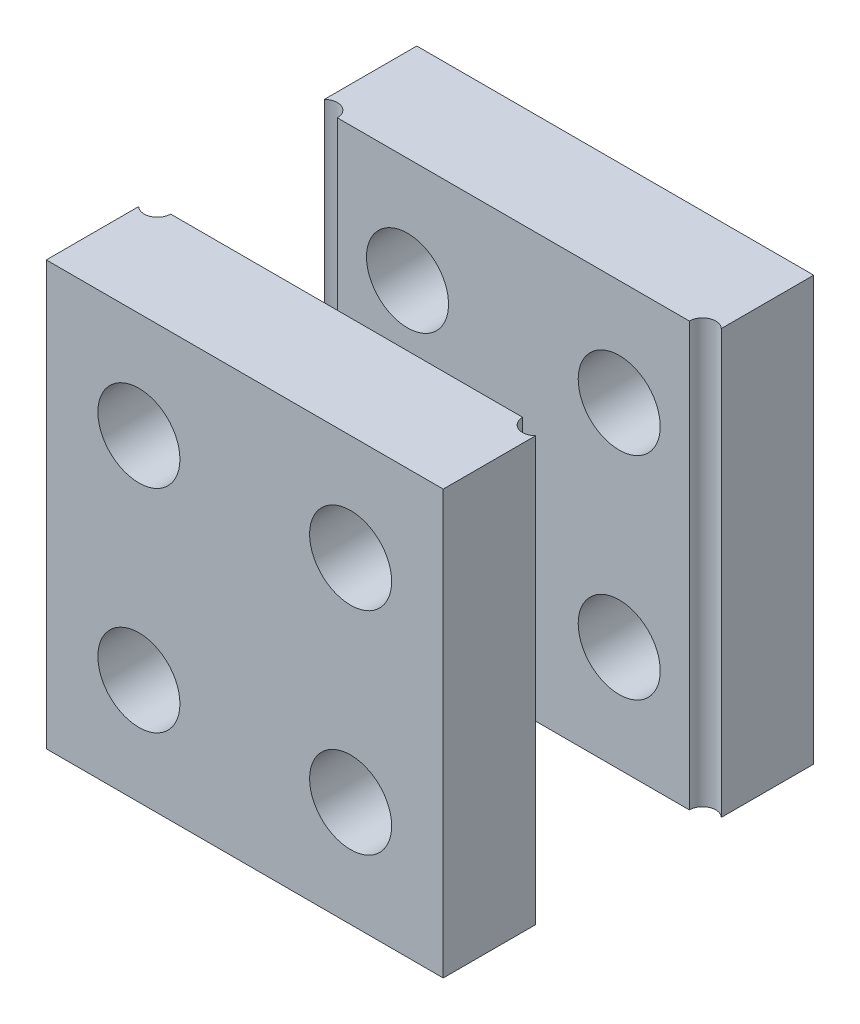
ISO-10303-21;
HEADER;
FILE_DESCRIPTION(('STEP AP214'),'2;1');
FILE_NAME('part.step','',(''),(''),'','','');
FILE_SCHEMA(('AUTOMOTIVE_DESIGN { 1 0 10303 214 1 1 1 1 }'));
ENDSEC;
DATA;
#1=APPLICATION_CONTEXT('core data for automotive mechanical design processes');
#2=APPLICATION_PROTOCOL_DEFINITION('international standard','automotive_design',2000,#1);
#3=PRODUCT_CONTEXT('',#1,'mechanical');
#4=PRODUCT('Part','Part','',(#3));
#5=PRODUCT_RELATED_PRODUCT_CATEGORY('part','',(#4));
#6=PRODUCT_DEFINITION_FORMATION('','',#4);
#7=PRODUCT_DEFINITION_CONTEXT('part definition',#1,'design');
#8=PRODUCT_DEFINITION('design','',#6,#7);
#9=PRODUCT_DEFINITION_SHAPE('','',#8);
#10=(LENGTH_UNIT() NAMED_UNIT(*) SI_UNIT(.MILLI.,.METRE.));
#11=(NAMED_UNIT(*) PLANE_ANGLE_UNIT() SI_UNIT($,.RADIAN.));
#12=(NAMED_UNIT(*) SI_UNIT($,.STERADIAN.) SOLID_ANGLE_UNIT());
#13=UNCERTAINTY_MEASURE_WITH_UNIT(LENGTH_MEASURE(1.E-05),#10,'distance_accuracy_value','');
#14=(GEOMETRIC_REPRESENTATION_CONTEXT(3) GLOBAL_UNCERTAINTY_ASSIGNED_CONTEXT((#13)) GLOBAL_UNIT_ASSIGNED_CONTEXT((#10,
#11,#12)) REPRESENTATION_CONTEXT('',''));
#15=CARTESIAN_POINT('',(0.,0.,0.));
#16=DIRECTION('',(0.,0.,1.));
#17=DIRECTION('',(1.,0.,0.));
#18=AXIS2_PLACEMENT_3D('',#15,#16,#17);
#19=CARTESIAN_POINT('',(7.5,-8.,14.));
#20=DIRECTION('',(0.,1.,0.));
#21=DIRECTION('',(-1.,0.,0.));
#22=AXIS2_PLACEMENT_3D('',#19,#20,#21);
#23=PLANE('',#22);
#24=DIRECTION('',(-1.,0.,0.));
#25=VECTOR('',#24,1.);
#26=CARTESIAN_POINT('',(0.,-8.,3.85));
#27=LINE('',#26,#25);
#28=CARTESIAN_POINT('',(6.65,-8.,3.85));
#29=VERTEX_POINT('',#28);
#30=CARTESIAN_POINT('',(-6.65,-8.,3.85));
#31=VERTEX_POINT('',#30);
#32=EDGE_CURVE('E161',#29,#31,#27,.T.);
#33=ORIENTED_EDGE('',*,*,#32,.T.);
#34=CARTESIAN_POINT('',(-7.15,-8.,3.85));
#35=DIRECTION('',(0.,1.,0.));
#36=DIRECTION('',(-1.,0.,0.));
#37=AXIS2_PLACEMENT_3D('',#34,#35,#36);
#38=CIRCLE('',#37,0.500000000000001);
#39=CARTESIAN_POINT('',(-7.5,-8.,3.49292857857286));
#40=VERTEX_POINT('',#39);
#41=EDGE_CURVE('E113',#31,#40,#38,.T.);
#42=ORIENTED_EDGE('',*,*,#41,.T.);
#43=DIRECTION('',(0.,0.,-1.));
#44=VECTOR('',#43,1.);
#45=CARTESIAN_POINT('',(-7.5,-8.00000000000001,14.));
#46=LINE('',#45,#44);
#47=CARTESIAN_POINT('',(-7.5,-8.00000000000001,0.));
#48=VERTEX_POINT('',#47);
#49=EDGE_CURVE('E107',#40,#48,#46,.T.);
#50=ORIENTED_EDGE('',*,*,#49,.T.);
#51=DIRECTION('',(1.,0.,0.));
#52=VECTOR('',#51,1.);
#53=CARTESIAN_POINT('',(7.5,-8.,0.));
#54=LINE('',#53,#52);
#55=CARTESIAN_POINT('',(7.5,-8.,0.));
#56=VERTEX_POINT('',#55);
#57=EDGE_CURVE('E111',#48,#56,#54,.T.);
#58=ORIENTED_EDGE('',*,*,#57,.T.);
#59=DIRECTION('',(0.,0.,-1.));
#60=VECTOR('',#59,1.);
#61=CARTESIAN_POINT('',(7.5,-8.,14.));
#62=LINE('',#61,#60);
#63=CARTESIAN_POINT('',(7.5,-8.,3.49292857857286));
#64=VERTEX_POINT('',#63);
#65=EDGE_CURVE('E123',#64,#56,#62,.T.);
#66=ORIENTED_EDGE('',*,*,#65,.F.);
#67=CARTESIAN_POINT('',(7.15,-8.,3.85));
#68=DIRECTION('',(0.,1.,0.));
#69=DIRECTION('',(-1.,0.,0.));
#70=AXIS2_PLACEMENT_3D('',#67,#68,#69);
#71=CIRCLE('',#70,0.500000000000001);
#72=EDGE_CURVE('E157',#29,#64,#71,.F.);
#73=ORIENTED_EDGE('',*,*,#72,.F.);
#74=EDGE_LOOP('',(#33,#42,#50,#58,#66,#73));
#75=FACE_BOUND('',#74,.T.);
#76=ADVANCED_FACE('F45',(#75),#23,.F.);
#77=CARTESIAN_POINT('',(7.5,-8.,14.));
#78=DIRECTION('',(-1.,0.,0.));
#79=DIRECTION('',(0.,-1.,0.));
#80=AXIS2_PLACEMENT_3D('',#77,#78,#79);
#81=PLANE('',#80);
#82=DIRECTION('',(0.,1.,0.));
#83=VECTOR('',#82,1.);
#84=CARTESIAN_POINT('',(7.5,-8.,3.49292857857286));
#85=LINE('',#84,#83);
#86=CARTESIAN_POINT('',(7.5,8.,3.49292857857286));
#87=VERTEX_POINT('',#86);
#88=EDGE_CURVE('E149',#64,#87,#85,.T.);
#89=ORIENTED_EDGE('',*,*,#88,.F.);
#90=ORIENTED_EDGE('',*,*,#65,.T.);
#91=DIRECTION('',(0.,1.,0.));
#92=VECTOR('',#91,1.);
#93=CARTESIAN_POINT('',(7.5,-8.,0.));
#94=LINE('',#93,#92);
#95=CARTESIAN_POINT('',(7.5,8.,0.));
#96=VERTEX_POINT('',#95);
#97=EDGE_CURVE('E122',#56,#96,#94,.T.);
#98=ORIENTED_EDGE('',*,*,#97,.T.);
#99=DIRECTION('',(0.,0.,-1.));
#100=VECTOR('',#99,1.);
#101=CARTESIAN_POINT('',(7.5,8.,14.));
#102=LINE('',#101,#100);
#103=EDGE_CURVE('E165',#87,#96,#102,.T.);
#104=ORIENTED_EDGE('',*,*,#103,.F.);
#105=EDGE_LOOP('',(#89,#90,#98,#104));
#106=FACE_BOUND('',#105,.T.);
#107=ADVANCED_FACE('F197',(#106),#81,.F.);
#108=CARTESIAN_POINT('',(7.5,8.,14.));
#109=DIRECTION('',(0.,-1.,0.));
#110=DIRECTION('',(1.,0.,0.));
#111=AXIS2_PLACEMENT_3D('',#108,#109,#110);
#112=PLANE('',#111);
#113=DIRECTION('',(0.,0.,-1.));
#114=VECTOR('',#113,1.);
#115=CARTESIAN_POINT('',(-7.5,8.,14.));
#116=LINE('',#115,#114);
#117=CARTESIAN_POINT('',(-7.5,8.,3.49292857857286));
#118=VERTEX_POINT('',#117);
#119=CARTESIAN_POINT('',(-7.5,8.,0.));
#120=VERTEX_POINT('',#119);
#121=EDGE_CURVE('E95',#118,#120,#116,.T.);
#122=ORIENTED_EDGE('',*,*,#121,.F.);
#123=CARTESIAN_POINT('',(-7.15,8.,3.85));
#124=DIRECTION('',(0.,1.,0.));
#125=DIRECTION('',(-1.,0.,0.));
#126=AXIS2_PLACEMENT_3D('',#123,#124,#125);
#127=CIRCLE('',#126,0.500000000000001);
#128=CARTESIAN_POINT('',(-6.65,8.,3.85));
#129=VERTEX_POINT('',#128);
#130=EDGE_CURVE('E49',#118,#129,#127,.F.);
#131=ORIENTED_EDGE('',*,*,#130,.T.);
#132=DIRECTION('',(-1.,0.,0.));
#133=VECTOR('',#132,1.);
#134=CARTESIAN_POINT('',(0.,8.,3.85));
#135=LINE('',#134,#133);
#136=CARTESIAN_POINT('',(6.65,8.,3.85));
#137=VERTEX_POINT('',#136);
#138=EDGE_CURVE('E12',#137,#129,#135,.T.);
#139=ORIENTED_EDGE('',*,*,#138,.F.);
#140=CARTESIAN_POINT('',(7.15,8.,3.85));
#141=DIRECTION('',(0.,1.,0.));
#142=DIRECTION('',(-1.,0.,0.));
#143=AXIS2_PLACEMENT_3D('',#140,#141,#142);
#144=CIRCLE('',#143,0.500000000000001);
#145=EDGE_CURVE('E127',#87,#137,#144,.T.);
#146=ORIENTED_EDGE('',*,*,#145,.F.);
#147=ORIENTED_EDGE('',*,*,#103,.T.);
#148=DIRECTION('',(-1.,0.,0.));
#149=VECTOR('',#148,1.);
#150=CARTESIAN_POINT('',(7.5,8.,0.));
#151=LINE('',#150,#149);
#152=EDGE_CURVE('E136',#96,#120,#151,.T.);
#153=ORIENTED_EDGE('',*,*,#152,.T.);
#154=EDGE_LOOP('',(#122,#131,#139,#146,#147,#153));
#155=FACE_BOUND('',#154,.T.);
#156=ADVANCED_FACE('F175',(#155),#112,.F.);
#157=CARTESIAN_POINT('',(0.,0.,0.));
#158=DIRECTION('',(0.,0.,1.));
#159=DIRECTION('',(1.,0.,0.));
#160=AXIS2_PLACEMENT_3D('',#157,#158,#159);
#161=PLANE('',#160);
#162=DIRECTION('',(0.,-1.,0.));
#163=VECTOR('',#162,1.);
#164=CARTESIAN_POINT('',(-7.5,-8.00000000000001,0.));
#165=LINE('',#164,#163);
#166=EDGE_CURVE('E120',#120,#48,#165,.T.);
#167=ORIENTED_EDGE('',*,*,#166,.F.);
#168=ORIENTED_EDGE('',*,*,#152,.F.);
#169=ORIENTED_EDGE('',*,*,#97,.F.);
#170=ORIENTED_EDGE('',*,*,#57,.F.);
#171=EDGE_LOOP('',(#167,#168,#169,#170));
#172=FACE_BOUND('',#171,.T.);
#173=CARTESIAN_POINT('',(-4.,4.,0.));
#174=DIRECTION('',(0.,0.,1.));
#175=DIRECTION('',(1.,0.,0.));
#176=AXIS2_PLACEMENT_3D('',#173,#174,#175);
#177=CIRCLE('',#176,1.55);
#178=CARTESIAN_POINT('',(-2.45,4.,0.));
#179=VERTEX_POINT('',#178);
#180=EDGE_CURVE('E132',#179,#179,#177,.T.);
#181=ORIENTED_EDGE('',*,*,#180,.T.);
#182=EDGE_LOOP('',(#181));
#183=FACE_BOUND('',#182,.T.);
#184=CARTESIAN_POINT('',(4.,4.,0.));
#185=DIRECTION('',(0.,0.,1.));
#186=DIRECTION('',(1.,0.,0.));
#187=AXIS2_PLACEMENT_3D('',#184,#185,#186);
#188=CIRCLE('',#187,1.55);
#189=CARTESIAN_POINT('',(5.55,4.,0.));
#190=VERTEX_POINT('',#189);
#191=EDGE_CURVE('E135',#190,#190,#188,.T.);
#192=ORIENTED_EDGE('',*,*,#191,.T.);
#193=EDGE_LOOP('',(#192));
#194=FACE_BOUND('',#193,.T.);
#195=CARTESIAN_POINT('',(-4.,-4.,0.));
#196=DIRECTION('',(0.,0.,1.));
#197=DIRECTION('',(1.,0.,0.));
#198=AXIS2_PLACEMENT_3D('',#195,#196,#197);
#199=CIRCLE('',#198,1.55);
#200=CARTESIAN_POINT('',(-2.45,-4.,0.));
#201=VERTEX_POINT('',#200);
#202=EDGE_CURVE('E139',#201,#201,#199,.T.);
#203=ORIENTED_EDGE('',*,*,#202,.T.);
#204=EDGE_LOOP('',(#203));
#205=FACE_BOUND('',#204,.T.);
#206=CARTESIAN_POINT('',(4.,-4.,0.));
#207=DIRECTION('',(0.,0.,1.));
#208=DIRECTION('',(1.,0.,0.));
#209=AXIS2_PLACEMENT_3D('',#206,#207,#208);
#210=CIRCLE('',#209,1.55);
#211=CARTESIAN_POINT('',(5.55,-4.,0.));
#212=VERTEX_POINT('',#211);
#213=EDGE_CURVE('E142',#212,#212,#210,.T.);
#214=ORIENTED_EDGE('',*,*,#213,.T.);
#215=EDGE_LOOP('',(#214));
#216=FACE_BOUND('',#215,.T.);
#217=ADVANCED_FACE('F117',(#172,#183,#194,#205,#216),#161,.F.);
#218=CARTESIAN_POINT('',(-7.5,-8.00000000000001,14.));
#219=DIRECTION('',(1.,0.,0.));
#220=DIRECTION('',(0.,1.,0.));
#221=AXIS2_PLACEMENT_3D('',#218,#219,#220);
#222=PLANE('',#221);
#223=ORIENTED_EDGE('',*,*,#49,.F.);
#224=DIRECTION('',(0.,1.,0.));
#225=VECTOR('',#224,1.);
#226=CARTESIAN_POINT('',(-7.5,-8.,3.49292857857286));
#227=LINE('',#226,#225);
#228=EDGE_CURVE('E87',#40,#118,#227,.T.);
#229=ORIENTED_EDGE('',*,*,#228,.T.);
#230=ORIENTED_EDGE('',*,*,#121,.T.);
#231=ORIENTED_EDGE('',*,*,#166,.T.);
#232=EDGE_LOOP('',(#223,#229,#230,#231));
#233=FACE_BOUND('',#232,.T.);
#234=ADVANCED_FACE('F125',(#233),#222,.F.);
#235=CARTESIAN_POINT('',(-4.,4.,14.));
#236=DIRECTION('',(0.,0.,-1.));
#237=DIRECTION('',(-1.,0.,0.));
#238=AXIS2_PLACEMENT_3D('',#235,#236,#237);
#239=CYLINDRICAL_SURFACE('',#238,1.55);
#240=CARTESIAN_POINT('',(-4.,4.,3.85));
#241=DIRECTION('',(0.,0.,-1.));
#242=DIRECTION('',(-1.,0.,0.));
#243=AXIS2_PLACEMENT_3D('',#240,#241,#242);
#244=CIRCLE('',#243,1.55);
#245=CARTESIAN_POINT('',(-5.55,4.,3.85));
#246=VERTEX_POINT('',#245);
#247=EDGE_CURVE('E145',#246,#246,#244,.T.);
#248=ORIENTED_EDGE('',*,*,#247,.F.);
#249=EDGE_LOOP('',(#248));
#250=FACE_BOUND('',#249,.T.);
#251=ORIENTED_EDGE('',*,*,#180,.F.);
#252=EDGE_LOOP('',(#251));
#253=FACE_BOUND('',#252,.T.);
#254=ADVANCED_FACE('F195',(#250,#253),#239,.F.);
#255=CARTESIAN_POINT('',(4.,4.,14.));
#256=DIRECTION('',(0.,0.,-1.));
#257=DIRECTION('',(-1.,0.,0.));
#258=AXIS2_PLACEMENT_3D('',#255,#256,#257);
#259=CYLINDRICAL_SURFACE('',#258,1.55);
#260=CARTESIAN_POINT('',(4.,4.,3.85));
#261=DIRECTION('',(0.,0.,-1.));
#262=DIRECTION('',(-1.,0.,0.));
#263=AXIS2_PLACEMENT_3D('',#260,#261,#262);
#264=CIRCLE('',#263,1.55);
#265=CARTESIAN_POINT('',(2.45,4.,3.85));
#266=VERTEX_POINT('',#265);
#267=EDGE_CURVE('E148',#266,#266,#264,.T.);
#268=ORIENTED_EDGE('',*,*,#267,.F.);
#269=EDGE_LOOP('',(#268));
#270=FACE_BOUND('',#269,.T.);
#271=ORIENTED_EDGE('',*,*,#191,.F.);
#272=EDGE_LOOP('',(#271));
#273=FACE_BOUND('',#272,.T.);
#274=ADVANCED_FACE('F208',(#270,#273),#259,.F.);
#275=CARTESIAN_POINT('',(-4.,-4.,14.));
#276=DIRECTION('',(0.,0.,-1.));
#277=DIRECTION('',(-1.,0.,0.));
#278=AXIS2_PLACEMENT_3D('',#275,#276,#277);
#279=CYLINDRICAL_SURFACE('',#278,1.55);
#280=CARTESIAN_POINT('',(-4.,-4.,3.85));
#281=DIRECTION('',(0.,0.,-1.));
#282=DIRECTION('',(-1.,0.,0.));
#283=AXIS2_PLACEMENT_3D('',#280,#281,#282);
#284=CIRCLE('',#283,1.55);
#285=CARTESIAN_POINT('',(-5.55,-4.,3.85));
#286=VERTEX_POINT('',#285);
#287=EDGE_CURVE('E152',#286,#286,#284,.T.);
#288=ORIENTED_EDGE('',*,*,#287,.F.);
#289=EDGE_LOOP('',(#288));
#290=FACE_BOUND('',#289,.T.);
#291=ORIENTED_EDGE('',*,*,#202,.F.);
#292=EDGE_LOOP('',(#291));
#293=FACE_BOUND('',#292,.T.);
#294=ADVANCED_FACE('F186',(#290,#293),#279,.F.);
#295=CARTESIAN_POINT('',(4.,-4.,14.));
#296=DIRECTION('',(0.,0.,-1.));
#297=DIRECTION('',(-1.,0.,0.));
#298=AXIS2_PLACEMENT_3D('',#295,#296,#297);
#299=CYLINDRICAL_SURFACE('',#298,1.55);
#300=CARTESIAN_POINT('',(4.,-4.,3.85));
#301=DIRECTION('',(0.,0.,-1.));
#302=DIRECTION('',(-1.,0.,0.));
#303=AXIS2_PLACEMENT_3D('',#300,#301,#302);
#304=CIRCLE('',#303,1.55);
#305=CARTESIAN_POINT('',(2.45,-4.,3.85));
#306=VERTEX_POINT('',#305);
#307=EDGE_CURVE('E155',#306,#306,#304,.T.);
#308=ORIENTED_EDGE('',*,*,#307,.F.);
#309=EDGE_LOOP('',(#308));
#310=FACE_BOUND('',#309,.T.);
#311=ORIENTED_EDGE('',*,*,#213,.F.);
#312=EDGE_LOOP('',(#311));
#313=FACE_BOUND('',#312,.T.);
#314=ADVANCED_FACE('F47',(#310,#313),#299,.F.);
#315=CARTESIAN_POINT('',(-7.15,-8.,3.85));
#316=DIRECTION('',(0.,1.,0.));
#317=DIRECTION('',(-1.,0.,0.));
#318=AXIS2_PLACEMENT_3D('',#315,#316,#317);
#319=CYLINDRICAL_SURFACE('',#318,0.500000000000001);
#320=ORIENTED_EDGE('',*,*,#228,.F.);
#321=ORIENTED_EDGE('',*,*,#41,.F.);
#322=DIRECTION('',(0.,1.,0.));
#323=VECTOR('',#322,1.);
#324=CARTESIAN_POINT('',(-6.65,-8.,3.85));
#325=LINE('',#324,#323);
#326=EDGE_CURVE('E64',#31,#129,#325,.T.);
#327=ORIENTED_EDGE('',*,*,#326,.T.);
#328=ORIENTED_EDGE('',*,*,#130,.F.);
#329=EDGE_LOOP('',(#320,#321,#327,#328));
#330=FACE_BOUND('',#329,.T.);
#331=ADVANCED_FACE('F185',(#330),#319,.F.);
#332=CARTESIAN_POINT('',(7.15,-8.,3.85));
#333=DIRECTION('',(0.,1.,0.));
#334=DIRECTION('',(-1.,0.,0.));
#335=AXIS2_PLACEMENT_3D('',#332,#333,#334);
#336=CYLINDRICAL_SURFACE('',#335,0.500000000000001);
#337=ORIENTED_EDGE('',*,*,#145,.T.);
#338=DIRECTION('',(0.,1.,0.));
#339=VECTOR('',#338,1.);
#340=CARTESIAN_POINT('',(6.65,-8.,3.85));
#341=LINE('',#340,#339);
#342=EDGE_CURVE('E54',#29,#137,#341,.T.);
#343=ORIENTED_EDGE('',*,*,#342,.F.);
#344=ORIENTED_EDGE('',*,*,#72,.T.);
#345=ORIENTED_EDGE('',*,*,#88,.T.);
#346=EDGE_LOOP('',(#337,#343,#344,#345));
#347=FACE_BOUND('',#346,.T.);
#348=ADVANCED_FACE('F169',(#347),#336,.F.);
#349=CARTESIAN_POINT('',(0.,-8.,3.85));
#350=DIRECTION('',(0.,0.,-1.));
#351=DIRECTION('',(-1.,0.,0.));
#352=AXIS2_PLACEMENT_3D('',#349,#350,#351);
#353=PLANE('',#352);
#354=ORIENTED_EDGE('',*,*,#247,.T.);
#355=EDGE_LOOP('',(#354));
#356=FACE_BOUND('',#355,.T.);
#357=ORIENTED_EDGE('',*,*,#267,.T.);
#358=EDGE_LOOP('',(#357));
#359=FACE_BOUND('',#358,.T.);
#360=ORIENTED_EDGE('',*,*,#287,.T.);
#361=EDGE_LOOP('',(#360));
#362=FACE_BOUND('',#361,.T.);
#363=ORIENTED_EDGE('',*,*,#307,.T.);
#364=EDGE_LOOP('',(#363));
#365=FACE_BOUND('',#364,.T.);
#366=ORIENTED_EDGE('',*,*,#326,.F.);
#367=ORIENTED_EDGE('',*,*,#32,.F.);
#368=ORIENTED_EDGE('',*,*,#342,.T.);
#369=ORIENTED_EDGE('',*,*,#138,.T.);
#370=EDGE_LOOP('',(#366,#367,#368,#369));
#371=FACE_BOUND('',#370,.T.);
#372=ADVANCED_FACE('F173',(#356,#359,#362,#365,#371),#353,.F.);
#373=CLOSED_SHELL('',(#76,#107,#156,#217,#234,#254,#274,#294,#314,#331,#348,#372));
#374=MANIFOLD_SOLID_BREP('B2',#373);
#375=CARTESIAN_POINT('',(4.,4.,14.));
#376=DIRECTION('',(0.,0.,-1.));
#377=DIRECTION('',(-1.,0.,0.));
#378=AXIS2_PLACEMENT_3D('',#375,#376,#377);
#379=CYLINDRICAL_SURFACE('',#378,1.55);
#380=CARTESIAN_POINT('',(4.,4.,14.));
#381=DIRECTION('',(0.,0.,1.));
#382=DIRECTION('',(1.,0.,0.));
#383=AXIS2_PLACEMENT_3D('',#380,#381,#382);
#384=CIRCLE('',#383,1.55);
#385=CARTESIAN_POINT('',(5.55,4.,14.));
#386=VERTEX_POINT('',#385);
#387=EDGE_CURVE('E405',#386,#386,#384,.T.);
#388=ORIENTED_EDGE('',*,*,#387,.T.);
#389=EDGE_LOOP('',(#388));
#390=FACE_BOUND('',#389,.T.);
#391=CARTESIAN_POINT('',(4.,4.,10.15));
#392=DIRECTION('',(0.,0.,-1.));
#393=DIRECTION('',(-1.,0.,0.));
#394=AXIS2_PLACEMENT_3D('',#391,#392,#393);
#395=CIRCLE('',#394,1.55);
#396=CARTESIAN_POINT('',(2.45,4.,10.15));
#397=VERTEX_POINT('',#396);
#398=EDGE_CURVE('E431',#397,#397,#395,.T.);
#399=ORIENTED_EDGE('',*,*,#398,.T.);
#400=EDGE_LOOP('',(#399));
#401=FACE_BOUND('',#400,.T.);
#402=ADVANCED_FACE('F305',(#390,#401),#379,.F.);
#403=CARTESIAN_POINT('',(7.5,8.,14.));
#404=DIRECTION('',(0.,-1.,0.));
#405=DIRECTION('',(1.,0.,0.));
#406=AXIS2_PLACEMENT_3D('',#403,#404,#405);
#407=PLANE('',#406);
#408=DIRECTION('',(0.,0.,-1.));
#409=VECTOR('',#408,1.);
#410=CARTESIAN_POINT('',(7.5,8.,14.));
#411=LINE('',#410,#409);
#412=CARTESIAN_POINT('',(7.5,8.,14.));
#413=VERTEX_POINT('',#412);
#414=CARTESIAN_POINT('',(7.5,8.,10.5070714214271));
#415=VERTEX_POINT('',#414);
#416=EDGE_CURVE('E367',#413,#415,#411,.T.);
#417=ORIENTED_EDGE('',*,*,#416,.T.);
#418=CARTESIAN_POINT('',(7.15,8.,10.15));
#419=DIRECTION('',(0.,1.,0.));
#420=DIRECTION('',(-1.,0.,0.));
#421=AXIS2_PLACEMENT_3D('',#418,#419,#420);
#422=CIRCLE('',#421,0.5);
#423=CARTESIAN_POINT('',(6.65,8.,10.15));
#424=VERTEX_POINT('',#423);
#425=EDGE_CURVE('E43',#415,#424,#422,.F.);
#426=ORIENTED_EDGE('',*,*,#425,.T.);
#427=DIRECTION('',(1.,0.,0.));
#428=VECTOR('',#427,1.);
#429=CARTESIAN_POINT('',(7.5,8.,10.15));
#430=LINE('',#429,#428);
#431=CARTESIAN_POINT('',(-6.65,8.,10.15));
#432=VERTEX_POINT('',#431);
#433=EDGE_CURVE('E346',#424,#432,#430,.F.);
#434=ORIENTED_EDGE('',*,*,#433,.T.);
#435=CARTESIAN_POINT('',(-7.15,8.,10.15));
#436=DIRECTION('',(0.,1.,0.));
#437=DIRECTION('',(-1.,0.,0.));
#438=AXIS2_PLACEMENT_3D('',#435,#436,#437);
#439=CIRCLE('',#438,0.5);
#440=CARTESIAN_POINT('',(-7.5,8.,10.5070714214271));
#441=VERTEX_POINT('',#440);
#442=EDGE_CURVE('E314',#441,#432,#439,.T.);
#443=ORIENTED_EDGE('',*,*,#442,.F.);
#444=DIRECTION('',(0.,0.,-1.));
#445=VECTOR('',#444,1.);
#446=CARTESIAN_POINT('',(-7.5,8.,14.));
#447=LINE('',#446,#445);
#448=CARTESIAN_POINT('',(-7.5,8.,14.));
#449=VERTEX_POINT('',#448);
#450=EDGE_CURVE('E373',#449,#441,#447,.T.);
#451=ORIENTED_EDGE('',*,*,#450,.F.);
#452=DIRECTION('',(-1.,0.,0.));
#453=VECTOR('',#452,1.);
#454=CARTESIAN_POINT('',(7.5,8.,14.));
#455=LINE('',#454,#453);
#456=EDGE_CURVE('E369',#413,#449,#455,.T.);
#457=ORIENTED_EDGE('',*,*,#456,.F.);
#458=EDGE_LOOP('',(#417,#426,#434,#443,#451,#457));
#459=FACE_BOUND('',#458,.T.);
#460=ADVANCED_FACE('F364',(#459),#407,.F.);
#461=CARTESIAN_POINT('',(7.5,-8.,14.));
#462=DIRECTION('',(-1.,0.,0.));
#463=DIRECTION('',(0.,-1.,0.));
#464=AXIS2_PLACEMENT_3D('',#461,#462,#463);
#465=PLANE('',#464);
#466=DIRECTION('',(0.,0.,-1.));
#467=VECTOR('',#466,1.);
#468=CARTESIAN_POINT('',(7.5,-8.,14.));
#469=LINE('',#468,#467);
#470=CARTESIAN_POINT('',(7.5,-8.,14.));
#471=VERTEX_POINT('',#470);
#472=CARTESIAN_POINT('',(7.5,-8.,10.5070714214271));
#473=VERTEX_POINT('',#472);
#474=EDGE_CURVE('E372',#471,#473,#469,.T.);
#475=ORIENTED_EDGE('',*,*,#474,.T.);
#476=DIRECTION('',(0.,1.,0.));
#477=VECTOR('',#476,1.);
#478=CARTESIAN_POINT('',(7.5,-8.,10.5070714214271));
#479=LINE('',#478,#477);
#480=EDGE_CURVE('E361',#473,#415,#479,.T.);
#481=ORIENTED_EDGE('',*,*,#480,.T.);
#482=ORIENTED_EDGE('',*,*,#416,.F.);
#483=DIRECTION('',(0.,1.,0.));
#484=VECTOR('',#483,1.);
#485=CARTESIAN_POINT('',(7.5,-8.,14.));
#486=LINE('',#485,#484);
#487=EDGE_CURVE('E402',#471,#413,#486,.T.);
#488=ORIENTED_EDGE('',*,*,#487,.F.);
#489=EDGE_LOOP('',(#475,#481,#482,#488));
#490=FACE_BOUND('',#489,.T.);
#491=ADVANCED_FACE('F413',(#490),#465,.F.);
#492=CARTESIAN_POINT('',(7.5,-8.,14.));
#493=DIRECTION('',(0.,1.,0.));
#494=DIRECTION('',(-1.,0.,0.));
#495=AXIS2_PLACEMENT_3D('',#492,#493,#494);
#496=PLANE('',#495);
#497=DIRECTION('',(-1.,0.,0.));
#498=VECTOR('',#497,1.);
#499=CARTESIAN_POINT('',(0.,-8.,10.15));
#500=LINE('',#499,#498);
#501=CARTESIAN_POINT('',(6.65,-8.,10.15));
#502=VERTEX_POINT('',#501);
#503=CARTESIAN_POINT('',(-6.65,-8.,10.15));
#504=VERTEX_POINT('',#503);
#505=EDGE_CURVE('E421',#502,#504,#500,.T.);
#506=ORIENTED_EDGE('',*,*,#505,.F.);
#507=CARTESIAN_POINT('',(7.15,-8.,10.15));
#508=DIRECTION('',(0.,1.,0.));
#509=DIRECTION('',(-1.,0.,0.));
#510=AXIS2_PLACEMENT_3D('',#507,#508,#509);
#511=CIRCLE('',#510,0.5);
#512=EDGE_CURVE('E359',#502,#473,#511,.T.);
#513=ORIENTED_EDGE('',*,*,#512,.T.);
#514=ORIENTED_EDGE('',*,*,#474,.F.);
#515=DIRECTION('',(1.,0.,0.));
#516=VECTOR('',#515,1.);
#517=CARTESIAN_POINT('',(7.5,-8.,14.));
#518=LINE('',#517,#516);
#519=CARTESIAN_POINT('',(-7.5,-8.00000000000001,14.));
#520=VERTEX_POINT('',#519);
#521=EDGE_CURVE('E399',#520,#471,#518,.T.);
#522=ORIENTED_EDGE('',*,*,#521,.F.);
#523=DIRECTION('',(0.,0.,-1.));
#524=VECTOR('',#523,1.);
#525=CARTESIAN_POINT('',(-7.5,-8.00000000000001,14.));
#526=LINE('',#525,#524);
#527=CARTESIAN_POINT('',(-7.5,-8.,10.5070714214271));
#528=VERTEX_POINT('',#527);
#529=EDGE_CURVE('E376',#520,#528,#526,.T.);
#530=ORIENTED_EDGE('',*,*,#529,.T.);
#531=CARTESIAN_POINT('',(-7.15,-8.,10.15));
#532=DIRECTION('',(0.,1.,0.));
#533=DIRECTION('',(-1.,0.,0.));
#534=AXIS2_PLACEMENT_3D('',#531,#532,#533);
#535=CIRCLE('',#534,0.5);
#536=EDGE_CURVE('E419',#504,#528,#535,.F.);
#537=ORIENTED_EDGE('',*,*,#536,.F.);
#538=EDGE_LOOP('',(#506,#513,#514,#522,#530,#537));
#539=FACE_BOUND('',#538,.T.);
#540=ADVANCED_FACE('F476',(#539),#496,.F.);
#541=CARTESIAN_POINT('',(-7.5,-8.00000000000001,14.));
#542=DIRECTION('',(1.,0.,0.));
#543=DIRECTION('',(0.,1.,0.));
#544=AXIS2_PLACEMENT_3D('',#541,#542,#543);
#545=PLANE('',#544);
#546=DIRECTION('',(0.,1.,0.));
#547=VECTOR('',#546,1.);
#548=CARTESIAN_POINT('',(-7.5,-8.,10.5070714214271));
#549=LINE('',#548,#547);
#550=EDGE_CURVE('E322',#528,#441,#549,.T.);
#551=ORIENTED_EDGE('',*,*,#550,.F.);
#552=ORIENTED_EDGE('',*,*,#529,.F.);
#553=DIRECTION('',(0.,-1.,0.));
#554=VECTOR('',#553,1.);
#555=CARTESIAN_POINT('',(-7.5,-8.00000000000001,14.));
#556=LINE('',#555,#554);
#557=EDGE_CURVE('E396',#449,#520,#556,.T.);
#558=ORIENTED_EDGE('',*,*,#557,.F.);
#559=ORIENTED_EDGE('',*,*,#450,.T.);
#560=EDGE_LOOP('',(#551,#552,#558,#559));
#561=FACE_BOUND('',#560,.T.);
#562=ADVANCED_FACE('F307',(#561),#545,.F.);
#563=CARTESIAN_POINT('',(-4.,4.,14.));
#564=DIRECTION('',(0.,0.,-1.));
#565=DIRECTION('',(-1.,0.,0.));
#566=AXIS2_PLACEMENT_3D('',#563,#564,#565);
#567=CYLINDRICAL_SURFACE('',#566,1.55);
#568=CARTESIAN_POINT('',(-4.,4.,14.));
#569=DIRECTION('',(0.,0.,1.));
#570=DIRECTION('',(1.,0.,0.));
#571=AXIS2_PLACEMENT_3D('',#568,#569,#570);
#572=CIRCLE('',#571,1.55);
#573=CARTESIAN_POINT('',(-2.45,4.,14.));
#574=VERTEX_POINT('',#573);
#575=EDGE_CURVE('E400',#574,#574,#572,.T.);
#576=ORIENTED_EDGE('',*,*,#575,.T.);
#577=EDGE_LOOP('',(#576));
#578=FACE_BOUND('',#577,.T.);
#579=CARTESIAN_POINT('',(-4.,4.,10.15));
#580=DIRECTION('',(0.,0.,-1.));
#581=DIRECTION('',(-1.,0.,0.));
#582=AXIS2_PLACEMENT_3D('',#579,#580,#581);
#583=CIRCLE('',#582,1.55);
#584=CARTESIAN_POINT('',(-5.55,4.,10.15));
#585=VERTEX_POINT('',#584);
#586=EDGE_CURVE('E356',#585,#585,#583,.T.);
#587=ORIENTED_EDGE('',*,*,#586,.T.);
#588=EDGE_LOOP('',(#587));
#589=FACE_BOUND('',#588,.T.);
#590=ADVANCED_FACE('F466',(#578,#589),#567,.F.);
#591=CARTESIAN_POINT('',(-4.,-4.,14.));
#592=DIRECTION('',(0.,0.,-1.));
#593=DIRECTION('',(-1.,0.,0.));
#594=AXIS2_PLACEMENT_3D('',#591,#592,#593);
#595=CYLINDRICAL_SURFACE('',#594,1.55);
#596=CARTESIAN_POINT('',(-4.,-4.,14.));
#597=DIRECTION('',(0.,0.,1.));
#598=DIRECTION('',(1.,0.,0.));
#599=AXIS2_PLACEMENT_3D('',#596,#597,#598);
#600=CIRCLE('',#599,1.55);
#601=CARTESIAN_POINT('',(-2.45,-4.,14.));
#602=VERTEX_POINT('',#601);
#603=EDGE_CURVE('E438',#602,#602,#600,.T.);
#604=ORIENTED_EDGE('',*,*,#603,.T.);
#605=EDGE_LOOP('',(#604));
#606=FACE_BOUND('',#605,.T.);
#607=CARTESIAN_POINT('',(-4.,-4.,10.15));
#608=DIRECTION('',(0.,0.,-1.));
#609=DIRECTION('',(-1.,0.,0.));
#610=AXIS2_PLACEMENT_3D('',#607,#608,#609);
#611=CIRCLE('',#610,1.55);
#612=CARTESIAN_POINT('',(-5.55,-4.,10.15));
#613=VERTEX_POINT('',#612);
#614=EDGE_CURVE('E387',#613,#613,#611,.T.);
#615=ORIENTED_EDGE('',*,*,#614,.T.);
#616=EDGE_LOOP('',(#615));
#617=FACE_BOUND('',#616,.T.);
#618=ADVANCED_FACE('F447',(#606,#617),#595,.F.);
#619=CARTESIAN_POINT('',(0.,0.,14.));
#620=DIRECTION('',(0.,0.,1.));
#621=DIRECTION('',(1.,0.,0.));
#622=AXIS2_PLACEMENT_3D('',#619,#620,#621);
#623=PLANE('',#622);
#624=ORIENTED_EDGE('',*,*,#603,.F.);
#625=EDGE_LOOP('',(#624));
#626=FACE_BOUND('',#625,.T.);
#627=ORIENTED_EDGE('',*,*,#575,.F.);
#628=EDGE_LOOP('',(#627));
#629=FACE_BOUND('',#628,.T.);
#630=ORIENTED_EDGE('',*,*,#557,.T.);
#631=ORIENTED_EDGE('',*,*,#521,.T.);
#632=ORIENTED_EDGE('',*,*,#487,.T.);
#633=ORIENTED_EDGE('',*,*,#456,.T.);
#634=EDGE_LOOP('',(#630,#631,#632,#633));
#635=FACE_BOUND('',#634,.T.);
#636=ORIENTED_EDGE('',*,*,#387,.F.);
#637=EDGE_LOOP('',(#636));
#638=FACE_BOUND('',#637,.T.);
#639=CARTESIAN_POINT('',(4.,-4.,14.));
#640=DIRECTION('',(0.,0.,1.));
#641=DIRECTION('',(1.,0.,0.));
#642=AXIS2_PLACEMENT_3D('',#639,#640,#641);
#643=CIRCLE('',#642,1.55);
#644=CARTESIAN_POINT('',(5.55,-4.,14.));
#645=VERTEX_POINT('',#644);
#646=EDGE_CURVE('E355',#645,#645,#643,.T.);
#647=ORIENTED_EDGE('',*,*,#646,.F.);
#648=EDGE_LOOP('',(#647));
#649=FACE_BOUND('',#648,.T.);
#650=ADVANCED_FACE('F410',(#626,#629,#635,#638,#649),#623,.T.);
#651=CARTESIAN_POINT('',(4.,-4.,14.));
#652=DIRECTION('',(0.,0.,-1.));
#653=DIRECTION('',(-1.,0.,0.));
#654=AXIS2_PLACEMENT_3D('',#651,#652,#653);
#655=CYLINDRICAL_SURFACE('',#654,1.55);
#656=ORIENTED_EDGE('',*,*,#646,.T.);
#657=EDGE_LOOP('',(#656));
#658=FACE_BOUND('',#657,.T.);
#659=CARTESIAN_POINT('',(4.,-4.,10.15));
#660=DIRECTION('',(0.,0.,-1.));
#661=DIRECTION('',(-1.,0.,0.));
#662=AXIS2_PLACEMENT_3D('',#659,#660,#661);
#663=CIRCLE('',#662,1.55);
#664=CARTESIAN_POINT('',(2.45,-4.,10.15));
#665=VERTEX_POINT('',#664);
#666=EDGE_CURVE('E384',#665,#665,#663,.T.);
#667=ORIENTED_EDGE('',*,*,#666,.T.);
#668=EDGE_LOOP('',(#667));
#669=FACE_BOUND('',#668,.T.);
#670=ADVANCED_FACE('F446',(#658,#669),#655,.F.);
#671=CARTESIAN_POINT('',(0.,-8.,10.15));
#672=DIRECTION('',(0.,0.,-1.));
#673=DIRECTION('',(-1.,0.,0.));
#674=AXIS2_PLACEMENT_3D('',#671,#672,#673);
#675=PLANE('',#674);
#676=ORIENTED_EDGE('',*,*,#666,.F.);
#677=EDGE_LOOP('',(#676));
#678=FACE_BOUND('',#677,.T.);
#679=ORIENTED_EDGE('',*,*,#614,.F.);
#680=EDGE_LOOP('',(#679));
#681=FACE_BOUND('',#680,.T.);
#682=ORIENTED_EDGE('',*,*,#398,.F.);
#683=EDGE_LOOP('',(#682));
#684=FACE_BOUND('',#683,.T.);
#685=ORIENTED_EDGE('',*,*,#586,.F.);
#686=EDGE_LOOP('',(#685));
#687=FACE_BOUND('',#686,.T.);
#688=ORIENTED_EDGE('',*,*,#433,.F.);
#689=DIRECTION('',(0.,1.,0.));
#690=VECTOR('',#689,1.);
#691=CARTESIAN_POINT('',(6.65,-8.,10.15));
#692=LINE('',#691,#690);
#693=EDGE_CURVE('E350',#502,#424,#692,.T.);
#694=ORIENTED_EDGE('',*,*,#693,.F.);
#695=ORIENTED_EDGE('',*,*,#505,.T.);
#696=DIRECTION('',(0.,1.,0.));
#697=VECTOR('',#696,1.);
#698=CARTESIAN_POINT('',(-6.65,-8.,10.15));
#699=LINE('',#698,#697);
#700=EDGE_CURVE('E353',#504,#432,#699,.T.);
#701=ORIENTED_EDGE('',*,*,#700,.T.);
#702=EDGE_LOOP('',(#688,#694,#695,#701));
#703=FACE_BOUND('',#702,.T.);
#704=ADVANCED_FACE('F347',(#678,#681,#684,#687,#703),#675,.T.);
#705=CARTESIAN_POINT('',(-7.15,-8.,10.15));
#706=DIRECTION('',(0.,1.,0.));
#707=DIRECTION('',(-1.,0.,0.));
#708=AXIS2_PLACEMENT_3D('',#705,#706,#707);
#709=CYLINDRICAL_SURFACE('',#708,0.5);
#710=ORIENTED_EDGE('',*,*,#442,.T.);
#711=ORIENTED_EDGE('',*,*,#700,.F.);
#712=ORIENTED_EDGE('',*,*,#536,.T.);
#713=ORIENTED_EDGE('',*,*,#550,.T.);
#714=EDGE_LOOP('',(#710,#711,#712,#713));
#715=FACE_BOUND('',#714,.T.);
#716=ADVANCED_FACE('F388',(#715),#709,.F.);
#717=CARTESIAN_POINT('',(7.15,-8.,10.15));
#718=DIRECTION('',(0.,1.,0.));
#719=DIRECTION('',(-1.,0.,0.));
#720=AXIS2_PLACEMENT_3D('',#717,#718,#719);
#721=CYLINDRICAL_SURFACE('',#720,0.5);
#722=ORIENTED_EDGE('',*,*,#480,.F.);
#723=ORIENTED_EDGE('',*,*,#512,.F.);
#724=ORIENTED_EDGE('',*,*,#693,.T.);
#725=ORIENTED_EDGE('',*,*,#425,.F.);
#726=EDGE_LOOP('',(#722,#723,#724,#725));
#727=FACE_BOUND('',#726,.T.);
#728=ADVANCED_FACE('F357',(#727),#721,.F.);
#729=CLOSED_SHELL('',(#402,#460,#491,#540,#562,#590,#618,#650,#670,#704,#716,#728));
#730=MANIFOLD_SOLID_BREP('B6',#729);
#731=ADVANCED_BREP_SHAPE_REPRESENTATION('',(#18,#374,#730),#14);
#732=SHAPE_DEFINITION_REPRESENTATION(#9,#731);
ENDSEC;
END-ISO-10303-21;
